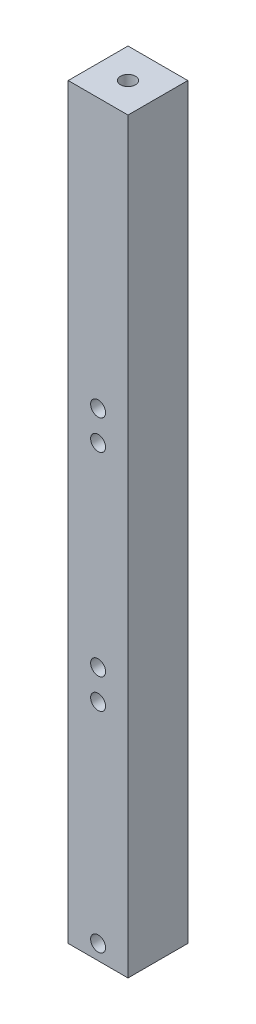
ISO-10303-21;
HEADER;
FILE_DESCRIPTION(('STEP AP214'),'2;1');
FILE_NAME('part.step','',(''),(''),'','','');
FILE_SCHEMA(('AUTOMOTIVE_DESIGN { 1 0 10303 214 1 1 1 1 }'));
ENDSEC;
DATA;
#1=APPLICATION_CONTEXT('core data for automotive mechanical design processes');
#2=APPLICATION_PROTOCOL_DEFINITION('international standard','automotive_design',2000,#1);
#3=PRODUCT_CONTEXT('',#1,'mechanical');
#4=PRODUCT('Part','Part','',(#3));
#5=PRODUCT_RELATED_PRODUCT_CATEGORY('part','',(#4));
#6=PRODUCT_DEFINITION_FORMATION('','',#4);
#7=PRODUCT_DEFINITION_CONTEXT('part definition',#1,'design');
#8=PRODUCT_DEFINITION('design','',#6,#7);
#9=PRODUCT_DEFINITION_SHAPE('','',#8);
#10=(LENGTH_UNIT() NAMED_UNIT(*) SI_UNIT(.MILLI.,.METRE.));
#11=(NAMED_UNIT(*) PLANE_ANGLE_UNIT() SI_UNIT($,.RADIAN.));
#12=(NAMED_UNIT(*) SI_UNIT($,.STERADIAN.) SOLID_ANGLE_UNIT());
#13=UNCERTAINTY_MEASURE_WITH_UNIT(LENGTH_MEASURE(1.E-05),#10,'distance_accuracy_value','');
#14=(GEOMETRIC_REPRESENTATION_CONTEXT(3) GLOBAL_UNCERTAINTY_ASSIGNED_CONTEXT((#13)) GLOBAL_UNIT_ASSIGNED_CONTEXT((#10,
#11,#12)) REPRESENTATION_CONTEXT('',''));
#15=CARTESIAN_POINT('',(0.,0.,0.));
#16=DIRECTION('',(0.,0.,1.));
#17=DIRECTION('',(1.,0.,0.));
#18=AXIS2_PLACEMENT_3D('',#15,#16,#17);
#19=CARTESIAN_POINT('',(0.,250.,0.));
#20=DIRECTION('',(0.,-1.,0.));
#21=DIRECTION('',(0.,0.,-1.));
#22=AXIS2_PLACEMENT_3D('',#19,#20,#21);
#23=CYLINDRICAL_SURFACE('',#22,2.5);
#24=CARTESIAN_POINT('',(0.,160.,0.));
#25=DIRECTION('',(0.,-0.707106781186547,0.707106781186547));
#26=DIRECTION('',(0.,-0.707106781186547,-0.707106781186547));
#27=AXIS2_PLACEMENT_3D('',#24,#25,#26);
#28=ELLIPSE('',#27,3.53553390593274,2.5);
#29=CARTESIAN_POINT('',(-2.5,160.,0.));
#30=VERTEX_POINT('',#29);
#31=CARTESIAN_POINT('',(2.5,160.,0.));
#32=VERTEX_POINT('',#31);
#33=EDGE_CURVE('E109',#30,#32,#28,.F.);
#34=ORIENTED_EDGE('',*,*,#33,.F.);
#35=CARTESIAN_POINT('',(0.,160.,0.));
#36=DIRECTION('',(0.,-0.707106781186547,-0.707106781186547));
#37=DIRECTION('',(0.,-0.707106781186547,0.707106781186547));
#38=AXIS2_PLACEMENT_3D('',#35,#36,#37);
#39=ELLIPSE('',#38,3.53553390593274,2.5);
#40=EDGE_CURVE('E47',#32,#30,#39,.F.);
#41=ORIENTED_EDGE('',*,*,#40,.F.);
#42=EDGE_LOOP('',(#34,#41));
#43=FACE_BOUND('',#42,.T.);
#44=CARTESIAN_POINT('',(0.,250.,0.));
#45=DIRECTION('',(0.,1.,0.));
#46=DIRECTION('',(0.,0.,1.));
#47=AXIS2_PLACEMENT_3D('',#44,#45,#46);
#48=CIRCLE('',#47,2.5);
#49=CARTESIAN_POINT('',(0.,250.,2.5));
#50=VERTEX_POINT('',#49);
#51=EDGE_CURVE('E179',#50,#50,#48,.T.);
#52=ORIENTED_EDGE('',*,*,#51,.T.);
#53=EDGE_LOOP('',(#52));
#54=FACE_BOUND('',#53,.T.);
#55=ADVANCED_FACE('F33',(#43,#54),#23,.F.);
#56=CARTESIAN_POINT('',(0.,160.,0.));
#57=DIRECTION('',(0.,-0.707106781186547,0.707106781186547));
#58=DIRECTION('',(0.,-0.707106781186547,-0.707106781186547));
#59=AXIS2_PLACEMENT_3D('',#56,#57,#58);
#60=ELLIPSE('',#59,3.53553390593274,2.5);
#61=EDGE_CURVE('E112',#30,#32,#60,.T.);
#62=ORIENTED_EDGE('',*,*,#61,.F.);
#63=CARTESIAN_POINT('',(0.,160.,0.));
#64=DIRECTION('',(0.,-0.707106781186547,-0.707106781186547));
#65=DIRECTION('',(0.,-0.707106781186547,0.707106781186547));
#66=AXIS2_PLACEMENT_3D('',#63,#64,#65);
#67=ELLIPSE('',#66,3.53553390593274,2.5);
#68=EDGE_CURVE('E106',#32,#30,#67,.T.);
#69=ORIENTED_EDGE('',*,*,#68,.F.);
#70=EDGE_LOOP('',(#62,#69));
#71=FACE_BOUND('',#70,.T.);
#72=CARTESIAN_POINT('',(0.,150.,0.));
#73=DIRECTION('',(0.,-0.707106781186547,0.707106781186547));
#74=DIRECTION('',(0.,-0.707106781186547,-0.707106781186547));
#75=AXIS2_PLACEMENT_3D('',#72,#73,#74);
#76=ELLIPSE('',#75,3.53553390593274,2.5);
#77=CARTESIAN_POINT('',(-2.5,150.,0.));
#78=VERTEX_POINT('',#77);
#79=CARTESIAN_POINT('',(2.5,150.,0.));
#80=VERTEX_POINT('',#79);
#81=EDGE_CURVE('E135',#78,#80,#76,.F.);
#82=ORIENTED_EDGE('',*,*,#81,.F.);
#83=CARTESIAN_POINT('',(0.,150.,0.));
#84=DIRECTION('',(0.,-0.707106781186547,-0.707106781186547));
#85=DIRECTION('',(0.,-0.707106781186547,0.707106781186547));
#86=AXIS2_PLACEMENT_3D('',#83,#84,#85);
#87=ELLIPSE('',#86,3.53553390593274,2.5);
#88=EDGE_CURVE('E54',#80,#78,#87,.F.);
#89=ORIENTED_EDGE('',*,*,#88,.F.);
#90=EDGE_LOOP('',(#82,#89));
#91=FACE_BOUND('',#90,.T.);
#92=ADVANCED_FACE('F122',(#71,#91),#23,.F.);
#93=CARTESIAN_POINT('',(0.,150.,0.));
#94=DIRECTION('',(0.,-0.707106781186547,0.707106781186547));
#95=DIRECTION('',(0.,-0.707106781186547,-0.707106781186547));
#96=AXIS2_PLACEMENT_3D('',#93,#94,#95);
#97=ELLIPSE('',#96,3.53553390593274,2.5);
#98=EDGE_CURVE('E133',#78,#80,#97,.T.);
#99=ORIENTED_EDGE('',*,*,#98,.F.);
#100=CARTESIAN_POINT('',(0.,150.,0.));
#101=DIRECTION('',(0.,-0.707106781186547,-0.707106781186547));
#102=DIRECTION('',(0.,-0.707106781186547,0.707106781186547));
#103=AXIS2_PLACEMENT_3D('',#100,#101,#102);
#104=ELLIPSE('',#103,3.53553390593274,2.5);
#105=EDGE_CURVE('E131',#80,#78,#104,.T.);
#106=ORIENTED_EDGE('',*,*,#105,.F.);
#107=EDGE_LOOP('',(#99,#106));
#108=FACE_BOUND('',#107,.T.);
#109=CARTESIAN_POINT('',(0.,85.,0.));
#110=DIRECTION('',(0.,-0.707106781186547,0.707106781186547));
#111=DIRECTION('',(0.,-0.707106781186547,-0.707106781186547));
#112=AXIS2_PLACEMENT_3D('',#109,#110,#111);
#113=ELLIPSE('',#112,3.53553390593274,2.5);
#114=CARTESIAN_POINT('',(-2.5,85.,0.));
#115=VERTEX_POINT('',#114);
#116=CARTESIAN_POINT('',(2.5,85.,0.));
#117=VERTEX_POINT('',#116);
#118=EDGE_CURVE('E152',#115,#117,#113,.F.);
#119=ORIENTED_EDGE('',*,*,#118,.F.);
#120=CARTESIAN_POINT('',(0.,85.,0.));
#121=DIRECTION('',(0.,-0.707106781186547,-0.707106781186547));
#122=DIRECTION('',(0.,-0.707106781186547,0.707106781186547));
#123=AXIS2_PLACEMENT_3D('',#120,#121,#122);
#124=ELLIPSE('',#123,3.53553390593274,2.5);
#125=EDGE_CURVE('E142',#117,#115,#124,.F.);
#126=ORIENTED_EDGE('',*,*,#125,.F.);
#127=EDGE_LOOP('',(#119,#126));
#128=FACE_BOUND('',#127,.T.);
#129=ADVANCED_FACE('F257',(#108,#128),#23,.F.);
#130=CARTESIAN_POINT('',(0.,85.,0.));
#131=DIRECTION('',(0.,-0.707106781186547,0.707106781186547));
#132=DIRECTION('',(0.,-0.707106781186547,-0.707106781186547));
#133=AXIS2_PLACEMENT_3D('',#130,#131,#132);
#134=ELLIPSE('',#133,3.53553390593274,2.5);
#135=EDGE_CURVE('E149',#115,#117,#134,.T.);
#136=ORIENTED_EDGE('',*,*,#135,.F.);
#137=CARTESIAN_POINT('',(0.,85.,0.));
#138=DIRECTION('',(0.,-0.707106781186547,-0.707106781186547));
#139=DIRECTION('',(0.,-0.707106781186547,0.707106781186547));
#140=AXIS2_PLACEMENT_3D('',#137,#138,#139);
#141=ELLIPSE('',#140,3.53553390593274,2.5);
#142=EDGE_CURVE('E147',#117,#115,#141,.T.);
#143=ORIENTED_EDGE('',*,*,#142,.F.);
#144=EDGE_LOOP('',(#136,#143));
#145=FACE_BOUND('',#144,.T.);
#146=CARTESIAN_POINT('',(0.,75.,0.));
#147=DIRECTION('',(0.,-0.707106781186547,0.707106781186547));
#148=DIRECTION('',(0.,-0.707106781186547,-0.707106781186547));
#149=AXIS2_PLACEMENT_3D('',#146,#147,#148);
#150=ELLIPSE('',#149,3.53553390593274,2.5);
#151=CARTESIAN_POINT('',(-2.5,75.,0.));
#152=VERTEX_POINT('',#151);
#153=CARTESIAN_POINT('',(2.5,75.,0.));
#154=VERTEX_POINT('',#153);
#155=EDGE_CURVE('E169',#152,#154,#150,.F.);
#156=ORIENTED_EDGE('',*,*,#155,.F.);
#157=CARTESIAN_POINT('',(0.,75.,0.));
#158=DIRECTION('',(0.,-0.707106781186547,-0.707106781186547));
#159=DIRECTION('',(0.,-0.707106781186547,0.707106781186547));
#160=AXIS2_PLACEMENT_3D('',#157,#158,#159);
#161=ELLIPSE('',#160,3.53553390593274,2.5);
#162=EDGE_CURVE('E159',#154,#152,#161,.F.);
#163=ORIENTED_EDGE('',*,*,#162,.F.);
#164=EDGE_LOOP('',(#156,#163));
#165=FACE_BOUND('',#164,.T.);
#166=ADVANCED_FACE('F364',(#145,#165),#23,.F.);
#167=CARTESIAN_POINT('',(0.,75.,0.));
#168=DIRECTION('',(0.,-0.707106781186547,0.707106781186547));
#169=DIRECTION('',(0.,-0.707106781186547,-0.707106781186547));
#170=AXIS2_PLACEMENT_3D('',#167,#168,#169);
#171=ELLIPSE('',#170,3.53553390593274,2.5);
#172=EDGE_CURVE('E166',#152,#154,#171,.T.);
#173=ORIENTED_EDGE('',*,*,#172,.F.);
#174=CARTESIAN_POINT('',(0.,75.,0.));
#175=DIRECTION('',(0.,-0.707106781186547,-0.707106781186547));
#176=DIRECTION('',(0.,-0.707106781186547,0.707106781186547));
#177=AXIS2_PLACEMENT_3D('',#174,#175,#176);
#178=ELLIPSE('',#177,3.53553390593274,2.5);
#179=EDGE_CURVE('E164',#154,#152,#178,.T.);
#180=ORIENTED_EDGE('',*,*,#179,.F.);
#181=EDGE_LOOP('',(#173,#180));
#182=FACE_BOUND('',#181,.T.);
#183=CARTESIAN_POINT('',(0.,5.,0.));
#184=DIRECTION('',(0.,-0.707106781186547,0.707106781186547));
#185=DIRECTION('',(0.,-0.707106781186547,-0.707106781186547));
#186=AXIS2_PLACEMENT_3D('',#183,#184,#185);
#187=ELLIPSE('',#186,3.53553390593274,2.5);
#188=CARTESIAN_POINT('',(-2.5,5.,0.));
#189=VERTEX_POINT('',#188);
#190=CARTESIAN_POINT('',(2.5,5.,0.));
#191=VERTEX_POINT('',#190);
#192=EDGE_CURVE('E11',#189,#191,#187,.F.);
#193=ORIENTED_EDGE('',*,*,#192,.F.);
#194=CARTESIAN_POINT('',(0.,5.,0.));
#195=DIRECTION('',(0.,-0.707106781186547,-0.707106781186547));
#196=DIRECTION('',(0.,-0.707106781186547,0.707106781186547));
#197=AXIS2_PLACEMENT_3D('',#194,#195,#196);
#198=ELLIPSE('',#197,3.53553390593274,2.5);
#199=EDGE_CURVE('E214',#191,#189,#198,.F.);
#200=ORIENTED_EDGE('',*,*,#199,.F.);
#201=EDGE_LOOP('',(#193,#200));
#202=FACE_BOUND('',#201,.T.);
#203=ADVANCED_FACE('F235',(#182,#202),#23,.F.);
#204=CARTESIAN_POINT('',(0.,250.,0.));
#205=DIRECTION('',(0.,-1.,0.));
#206=DIRECTION('',(0.,0.,-1.));
#207=AXIS2_PLACEMENT_3D('',#204,#205,#206);
#208=PLANE('',#207);
#209=DIRECTION('',(0.,0.,-1.));
#210=VECTOR('',#209,1.);
#211=CARTESIAN_POINT('',(10.,250.,10.));
#212=LINE('',#211,#210);
#213=CARTESIAN_POINT('',(10.,250.,10.));
#214=VERTEX_POINT('',#213);
#215=CARTESIAN_POINT('',(10.,250.,-10.));
#216=VERTEX_POINT('',#215);
#217=EDGE_CURVE('E185',#214,#216,#212,.T.);
#218=ORIENTED_EDGE('',*,*,#217,.T.);
#219=DIRECTION('',(-1.,0.,0.));
#220=VECTOR('',#219,1.);
#221=CARTESIAN_POINT('',(-10.,250.,-10.));
#222=LINE('',#221,#220);
#223=CARTESIAN_POINT('',(-10.,250.,-10.));
#224=VERTEX_POINT('',#223);
#225=EDGE_CURVE('E188',#216,#224,#222,.T.);
#226=ORIENTED_EDGE('',*,*,#225,.T.);
#227=DIRECTION('',(0.,0.,1.));
#228=VECTOR('',#227,1.);
#229=CARTESIAN_POINT('',(-10.,250.,10.));
#230=LINE('',#229,#228);
#231=CARTESIAN_POINT('',(-10.,250.,10.));
#232=VERTEX_POINT('',#231);
#233=EDGE_CURVE('E191',#224,#232,#230,.T.);
#234=ORIENTED_EDGE('',*,*,#233,.T.);
#235=DIRECTION('',(1.,0.,0.));
#236=VECTOR('',#235,1.);
#237=CARTESIAN_POINT('',(-10.,250.,10.));
#238=LINE('',#237,#236);
#239=EDGE_CURVE('E193',#232,#214,#238,.T.);
#240=ORIENTED_EDGE('',*,*,#239,.T.);
#241=EDGE_LOOP('',(#218,#226,#234,#240));
#242=FACE_BOUND('',#241,.T.);
#243=ORIENTED_EDGE('',*,*,#51,.F.);
#244=EDGE_LOOP('',(#243));
#245=FACE_BOUND('',#244,.T.);
#246=ADVANCED_FACE('F240',(#242,#245),#208,.F.);
#247=CARTESIAN_POINT('',(0.,0.,0.));
#248=DIRECTION('',(0.,-1.,0.));
#249=DIRECTION('',(0.,0.,-1.));
#250=AXIS2_PLACEMENT_3D('',#247,#248,#249);
#251=PLANE('',#250);
#252=DIRECTION('',(0.,0.,-1.));
#253=VECTOR('',#252,1.);
#254=CARTESIAN_POINT('',(10.,0.,10.));
#255=LINE('',#254,#253);
#256=CARTESIAN_POINT('',(10.,0.,10.));
#257=VERTEX_POINT('',#256);
#258=CARTESIAN_POINT('',(10.,0.,-10.));
#259=VERTEX_POINT('',#258);
#260=EDGE_CURVE('E182',#257,#259,#255,.T.);
#261=ORIENTED_EDGE('',*,*,#260,.F.);
#262=DIRECTION('',(1.,0.,0.));
#263=VECTOR('',#262,1.);
#264=CARTESIAN_POINT('',(-10.,0.,10.));
#265=LINE('',#264,#263);
#266=CARTESIAN_POINT('',(-10.,0.,10.));
#267=VERTEX_POINT('',#266);
#268=EDGE_CURVE('E189',#267,#257,#265,.T.);
#269=ORIENTED_EDGE('',*,*,#268,.F.);
#270=DIRECTION('',(0.,0.,1.));
#271=VECTOR('',#270,1.);
#272=CARTESIAN_POINT('',(-10.,0.,10.));
#273=LINE('',#272,#271);
#274=CARTESIAN_POINT('',(-10.,0.,-10.));
#275=VERTEX_POINT('',#274);
#276=EDGE_CURVE('E200',#275,#267,#273,.T.);
#277=ORIENTED_EDGE('',*,*,#276,.F.);
#278=DIRECTION('',(-1.,0.,0.));
#279=VECTOR('',#278,1.);
#280=CARTESIAN_POINT('',(-10.,0.,-10.));
#281=LINE('',#280,#279);
#282=EDGE_CURVE('E198',#259,#275,#281,.T.);
#283=ORIENTED_EDGE('',*,*,#282,.F.);
#284=EDGE_LOOP('',(#261,#269,#277,#283));
#285=FACE_BOUND('',#284,.T.);
#286=CARTESIAN_POINT('',(0.,0.,0.));
#287=DIRECTION('',(0.,1.,0.));
#288=DIRECTION('',(0.,0.,1.));
#289=AXIS2_PLACEMENT_3D('',#286,#287,#288);
#290=CIRCLE('',#289,2.5);
#291=CARTESIAN_POINT('',(0.,0.,2.5));
#292=VERTEX_POINT('',#291);
#293=EDGE_CURVE('E176',#292,#292,#290,.T.);
#294=ORIENTED_EDGE('',*,*,#293,.T.);
#295=EDGE_LOOP('',(#294));
#296=FACE_BOUND('',#295,.T.);
#297=ADVANCED_FACE('F238',(#285,#296),#251,.T.);
#298=CARTESIAN_POINT('',(10.,250.,10.));
#299=DIRECTION('',(-1.,0.,0.));
#300=DIRECTION('',(0.,0.,1.));
#301=AXIS2_PLACEMENT_3D('',#298,#299,#300);
#302=PLANE('',#301);
#303=ORIENTED_EDGE('',*,*,#260,.T.);
#304=DIRECTION('',(0.,-1.,0.));
#305=VECTOR('',#304,1.);
#306=CARTESIAN_POINT('',(10.,250.,-10.));
#307=LINE('',#306,#305);
#308=EDGE_CURVE('E211',#216,#259,#307,.T.);
#309=ORIENTED_EDGE('',*,*,#308,.F.);
#310=ORIENTED_EDGE('',*,*,#217,.F.);
#311=DIRECTION('',(0.,-1.,0.));
#312=VECTOR('',#311,1.);
#313=CARTESIAN_POINT('',(10.,250.,10.));
#314=LINE('',#313,#312);
#315=EDGE_CURVE('E195',#214,#257,#314,.T.);
#316=ORIENTED_EDGE('',*,*,#315,.T.);
#317=EDGE_LOOP('',(#303,#309,#310,#316));
#318=FACE_BOUND('',#317,.T.);
#319=ADVANCED_FACE('F35',(#318),#302,.F.);
#320=CARTESIAN_POINT('',(-10.,250.,-10.));
#321=DIRECTION('',(0.,0.,1.));
#322=DIRECTION('',(1.,0.,0.));
#323=AXIS2_PLACEMENT_3D('',#320,#321,#322);
#324=PLANE('',#323);
#325=CARTESIAN_POINT('',(0.,160.,-10.));
#326=DIRECTION('',(0.,0.,1.));
#327=DIRECTION('',(1.,0.,0.));
#328=AXIS2_PLACEMENT_3D('',#325,#326,#327);
#329=CIRCLE('',#328,2.5);
#330=CARTESIAN_POINT('',(2.5,160.,-10.));
#331=VERTEX_POINT('',#330);
#332=EDGE_CURVE('E117',#331,#331,#329,.T.);
#333=ORIENTED_EDGE('',*,*,#332,.T.);
#334=EDGE_LOOP('',(#333));
#335=FACE_BOUND('',#334,.T.);
#336=CARTESIAN_POINT('',(0.,150.,-10.));
#337=DIRECTION('',(0.,0.,1.));
#338=DIRECTION('',(1.,0.,0.));
#339=AXIS2_PLACEMENT_3D('',#336,#337,#338);
#340=CIRCLE('',#339,2.5);
#341=CARTESIAN_POINT('',(2.5,150.,-10.));
#342=VERTEX_POINT('',#341);
#343=EDGE_CURVE('E125',#342,#342,#340,.T.);
#344=ORIENTED_EDGE('',*,*,#343,.T.);
#345=EDGE_LOOP('',(#344));
#346=FACE_BOUND('',#345,.T.);
#347=CARTESIAN_POINT('',(0.,85.,-10.));
#348=DIRECTION('',(0.,0.,1.));
#349=DIRECTION('',(1.,0.,0.));
#350=AXIS2_PLACEMENT_3D('',#347,#348,#349);
#351=CIRCLE('',#350,2.5);
#352=CARTESIAN_POINT('',(2.5,85.,-10.));
#353=VERTEX_POINT('',#352);
#354=EDGE_CURVE('E139',#353,#353,#351,.T.);
#355=ORIENTED_EDGE('',*,*,#354,.T.);
#356=EDGE_LOOP('',(#355));
#357=FACE_BOUND('',#356,.T.);
#358=CARTESIAN_POINT('',(0.,75.,-10.));
#359=DIRECTION('',(0.,0.,1.));
#360=DIRECTION('',(1.,0.,0.));
#361=AXIS2_PLACEMENT_3D('',#358,#359,#360);
#362=CIRCLE('',#361,2.5);
#363=CARTESIAN_POINT('',(2.5,75.,-10.));
#364=VERTEX_POINT('',#363);
#365=EDGE_CURVE('E156',#364,#364,#362,.T.);
#366=ORIENTED_EDGE('',*,*,#365,.T.);
#367=EDGE_LOOP('',(#366));
#368=FACE_BOUND('',#367,.T.);
#369=CARTESIAN_POINT('',(0.,5.,-10.));
#370=DIRECTION('',(0.,0.,1.));
#371=DIRECTION('',(1.,0.,0.));
#372=AXIS2_PLACEMENT_3D('',#369,#370,#371);
#373=CIRCLE('',#372,2.5);
#374=CARTESIAN_POINT('',(2.5,5.,-10.));
#375=VERTEX_POINT('',#374);
#376=EDGE_CURVE('E173',#375,#375,#373,.T.);
#377=ORIENTED_EDGE('',*,*,#376,.T.);
#378=EDGE_LOOP('',(#377));
#379=FACE_BOUND('',#378,.T.);
#380=ORIENTED_EDGE('',*,*,#282,.T.);
#381=DIRECTION('',(0.,-1.,0.));
#382=VECTOR('',#381,1.);
#383=CARTESIAN_POINT('',(-10.,250.,-10.));
#384=LINE('',#383,#382);
#385=EDGE_CURVE('E208',#224,#275,#384,.T.);
#386=ORIENTED_EDGE('',*,*,#385,.F.);
#387=ORIENTED_EDGE('',*,*,#225,.F.);
#388=ORIENTED_EDGE('',*,*,#308,.T.);
#389=EDGE_LOOP('',(#380,#386,#387,#388));
#390=FACE_BOUND('',#389,.T.);
#391=ADVANCED_FACE('F247',(#335,#346,#357,#368,#379,#390),#324,.F.);
#392=CARTESIAN_POINT('',(-10.,250.,10.));
#393=DIRECTION('',(1.,0.,0.));
#394=DIRECTION('',(0.,0.,-1.));
#395=AXIS2_PLACEMENT_3D('',#392,#393,#394);
#396=PLANE('',#395);
#397=ORIENTED_EDGE('',*,*,#276,.T.);
#398=DIRECTION('',(0.,-1.,0.));
#399=VECTOR('',#398,1.);
#400=CARTESIAN_POINT('',(-10.,250.,10.));
#401=LINE('',#400,#399);
#402=EDGE_CURVE('E205',#232,#267,#401,.T.);
#403=ORIENTED_EDGE('',*,*,#402,.F.);
#404=ORIENTED_EDGE('',*,*,#233,.F.);
#405=ORIENTED_EDGE('',*,*,#385,.T.);
#406=EDGE_LOOP('',(#397,#403,#404,#405));
#407=FACE_BOUND('',#406,.T.);
#408=ADVANCED_FACE('F290',(#407),#396,.F.);
#409=CARTESIAN_POINT('',(-10.,250.,10.));
#410=DIRECTION('',(0.,0.,-1.));
#411=DIRECTION('',(-1.,0.,0.));
#412=AXIS2_PLACEMENT_3D('',#409,#410,#411);
#413=PLANE('',#412);
#414=CARTESIAN_POINT('',(0.,160.,10.));
#415=DIRECTION('',(0.,0.,1.));
#416=DIRECTION('',(1.,0.,0.));
#417=AXIS2_PLACEMENT_3D('',#414,#415,#416);
#418=CIRCLE('',#417,2.5);
#419=CARTESIAN_POINT('',(2.5,160.,10.));
#420=VERTEX_POINT('',#419);
#421=EDGE_CURVE('E320',#420,#420,#418,.T.);
#422=ORIENTED_EDGE('',*,*,#421,.F.);
#423=EDGE_LOOP('',(#422));
#424=FACE_BOUND('',#423,.T.);
#425=CARTESIAN_POINT('',(0.,150.,10.));
#426=DIRECTION('',(0.,0.,1.));
#427=DIRECTION('',(1.,0.,0.));
#428=AXIS2_PLACEMENT_3D('',#425,#426,#427);
#429=CIRCLE('',#428,2.5);
#430=CARTESIAN_POINT('',(2.5,150.,10.));
#431=VERTEX_POINT('',#430);
#432=EDGE_CURVE('E120',#431,#431,#429,.T.);
#433=ORIENTED_EDGE('',*,*,#432,.F.);
#434=EDGE_LOOP('',(#433));
#435=FACE_BOUND('',#434,.T.);
#436=CARTESIAN_POINT('',(0.,85.,10.));
#437=DIRECTION('',(0.,0.,1.));
#438=DIRECTION('',(1.,0.,0.));
#439=AXIS2_PLACEMENT_3D('',#436,#437,#438);
#440=CIRCLE('',#439,2.5);
#441=CARTESIAN_POINT('',(2.5,85.,10.));
#442=VERTEX_POINT('',#441);
#443=EDGE_CURVE('E138',#442,#442,#440,.T.);
#444=ORIENTED_EDGE('',*,*,#443,.F.);
#445=EDGE_LOOP('',(#444));
#446=FACE_BOUND('',#445,.T.);
#447=CARTESIAN_POINT('',(0.,75.,10.));
#448=DIRECTION('',(0.,0.,1.));
#449=DIRECTION('',(1.,0.,0.));
#450=AXIS2_PLACEMENT_3D('',#447,#448,#449);
#451=CIRCLE('',#450,2.5);
#452=CARTESIAN_POINT('',(2.5,75.,10.));
#453=VERTEX_POINT('',#452);
#454=EDGE_CURVE('E155',#453,#453,#451,.T.);
#455=ORIENTED_EDGE('',*,*,#454,.F.);
#456=EDGE_LOOP('',(#455));
#457=FACE_BOUND('',#456,.T.);
#458=CARTESIAN_POINT('',(0.,5.,10.));
#459=DIRECTION('',(0.,0.,1.));
#460=DIRECTION('',(1.,0.,0.));
#461=AXIS2_PLACEMENT_3D('',#458,#459,#460);
#462=CIRCLE('',#461,2.5);
#463=CARTESIAN_POINT('',(2.5,5.,10.));
#464=VERTEX_POINT('',#463);
#465=EDGE_CURVE('E172',#464,#464,#462,.T.);
#466=ORIENTED_EDGE('',*,*,#465,.F.);
#467=EDGE_LOOP('',(#466));
#468=FACE_BOUND('',#467,.T.);
#469=ORIENTED_EDGE('',*,*,#268,.T.);
#470=ORIENTED_EDGE('',*,*,#315,.F.);
#471=ORIENTED_EDGE('',*,*,#239,.F.);
#472=ORIENTED_EDGE('',*,*,#402,.T.);
#473=EDGE_LOOP('',(#469,#470,#471,#472));
#474=FACE_BOUND('',#473,.T.);
#475=ADVANCED_FACE('F233',(#424,#435,#446,#457,#468,#474),#413,.F.);
#476=CARTESIAN_POINT('',(0.,5.,0.));
#477=DIRECTION('',(0.,-0.707106781186547,0.707106781186547));
#478=DIRECTION('',(0.,-0.707106781186547,-0.707106781186547));
#479=AXIS2_PLACEMENT_3D('',#476,#477,#478);
#480=ELLIPSE('',#479,3.53553390593274,2.5);
#481=EDGE_CURVE('E41',#189,#191,#480,.T.);
#482=ORIENTED_EDGE('',*,*,#481,.F.);
#483=CARTESIAN_POINT('',(0.,5.,0.));
#484=DIRECTION('',(0.,-0.707106781186547,-0.707106781186547));
#485=DIRECTION('',(0.,-0.707106781186547,0.707106781186547));
#486=AXIS2_PLACEMENT_3D('',#483,#484,#485);
#487=ELLIPSE('',#486,3.53553390593274,2.5);
#488=EDGE_CURVE('E217',#191,#189,#487,.T.);
#489=ORIENTED_EDGE('',*,*,#488,.F.);
#490=EDGE_LOOP('',(#482,#489));
#491=FACE_BOUND('',#490,.T.);
#492=ORIENTED_EDGE('',*,*,#293,.F.);
#493=EDGE_LOOP('',(#492));
#494=FACE_BOUND('',#493,.T.);
#495=ADVANCED_FACE('F230',(#491,#494),#23,.F.);
#496=CARTESIAN_POINT('',(0.,5.,-10.));
#497=DIRECTION('',(0.,0.,1.));
#498=DIRECTION('',(1.,0.,0.));
#499=AXIS2_PLACEMENT_3D('',#496,#497,#498);
#500=CYLINDRICAL_SURFACE('',#499,2.5);
#501=ORIENTED_EDGE('',*,*,#481,.T.);
#502=ORIENTED_EDGE('',*,*,#199,.T.);
#503=EDGE_LOOP('',(#501,#502));
#504=FACE_BOUND('',#503,.T.);
#505=ORIENTED_EDGE('',*,*,#376,.F.);
#506=EDGE_LOOP('',(#505));
#507=FACE_BOUND('',#506,.T.);
#508=ADVANCED_FACE('F221',(#504,#507),#500,.F.);
#509=ORIENTED_EDGE('',*,*,#192,.T.);
#510=ORIENTED_EDGE('',*,*,#488,.T.);
#511=EDGE_LOOP('',(#509,#510));
#512=FACE_BOUND('',#511,.T.);
#513=ORIENTED_EDGE('',*,*,#465,.T.);
#514=EDGE_LOOP('',(#513));
#515=FACE_BOUND('',#514,.T.);
#516=ADVANCED_FACE('F227',(#512,#515),#500,.F.);
#517=CARTESIAN_POINT('',(0.,75.,-10.));
#518=DIRECTION('',(0.,0.,1.));
#519=DIRECTION('',(1.,0.,0.));
#520=AXIS2_PLACEMENT_3D('',#517,#518,#519);
#521=CYLINDRICAL_SURFACE('',#520,2.5);
#522=ORIENTED_EDGE('',*,*,#155,.T.);
#523=ORIENTED_EDGE('',*,*,#179,.T.);
#524=EDGE_LOOP('',(#522,#523));
#525=FACE_BOUND('',#524,.T.);
#526=ORIENTED_EDGE('',*,*,#454,.T.);
#527=EDGE_LOOP('',(#526));
#528=FACE_BOUND('',#527,.T.);
#529=ADVANCED_FACE('F261',(#525,#528),#521,.F.);
#530=ORIENTED_EDGE('',*,*,#172,.T.);
#531=ORIENTED_EDGE('',*,*,#162,.T.);
#532=EDGE_LOOP('',(#530,#531));
#533=FACE_BOUND('',#532,.T.);
#534=ORIENTED_EDGE('',*,*,#365,.F.);
#535=EDGE_LOOP('',(#534));
#536=FACE_BOUND('',#535,.T.);
#537=ADVANCED_FACE('F264',(#533,#536),#521,.F.);
#538=CARTESIAN_POINT('',(0.,85.,-10.));
#539=DIRECTION('',(0.,0.,1.));
#540=DIRECTION('',(1.,0.,0.));
#541=AXIS2_PLACEMENT_3D('',#538,#539,#540);
#542=CYLINDRICAL_SURFACE('',#541,2.5);
#543=ORIENTED_EDGE('',*,*,#118,.T.);
#544=ORIENTED_EDGE('',*,*,#142,.T.);
#545=EDGE_LOOP('',(#543,#544));
#546=FACE_BOUND('',#545,.T.);
#547=ORIENTED_EDGE('',*,*,#443,.T.);
#548=EDGE_LOOP('',(#547));
#549=FACE_BOUND('',#548,.T.);
#550=ADVANCED_FACE('F266',(#546,#549),#542,.F.);
#551=ORIENTED_EDGE('',*,*,#135,.T.);
#552=ORIENTED_EDGE('',*,*,#125,.T.);
#553=EDGE_LOOP('',(#551,#552));
#554=FACE_BOUND('',#553,.T.);
#555=ORIENTED_EDGE('',*,*,#354,.F.);
#556=EDGE_LOOP('',(#555));
#557=FACE_BOUND('',#556,.T.);
#558=ADVANCED_FACE('F269',(#554,#557),#542,.F.);
#559=CARTESIAN_POINT('',(0.,150.,-10.));
#560=DIRECTION('',(0.,0.,1.));
#561=DIRECTION('',(1.,0.,0.));
#562=AXIS2_PLACEMENT_3D('',#559,#560,#561);
#563=CYLINDRICAL_SURFACE('',#562,2.5);
#564=ORIENTED_EDGE('',*,*,#81,.T.);
#565=ORIENTED_EDGE('',*,*,#105,.T.);
#566=EDGE_LOOP('',(#564,#565));
#567=FACE_BOUND('',#566,.T.);
#568=ORIENTED_EDGE('',*,*,#432,.T.);
#569=EDGE_LOOP('',(#568));
#570=FACE_BOUND('',#569,.T.);
#571=ADVANCED_FACE('F271',(#567,#570),#563,.F.);
#572=ORIENTED_EDGE('',*,*,#98,.T.);
#573=ORIENTED_EDGE('',*,*,#88,.T.);
#574=EDGE_LOOP('',(#572,#573));
#575=FACE_BOUND('',#574,.T.);
#576=ORIENTED_EDGE('',*,*,#343,.F.);
#577=EDGE_LOOP('',(#576));
#578=FACE_BOUND('',#577,.T.);
#579=ADVANCED_FACE('F274',(#575,#578),#563,.F.);
#580=CARTESIAN_POINT('',(0.,160.,-10.));
#581=DIRECTION('',(0.,0.,1.));
#582=DIRECTION('',(1.,0.,0.));
#583=AXIS2_PLACEMENT_3D('',#580,#581,#582);
#584=CYLINDRICAL_SURFACE('',#583,2.5);
#585=ORIENTED_EDGE('',*,*,#33,.T.);
#586=ORIENTED_EDGE('',*,*,#68,.T.);
#587=EDGE_LOOP('',(#585,#586));
#588=FACE_BOUND('',#587,.T.);
#589=ORIENTED_EDGE('',*,*,#421,.T.);
#590=EDGE_LOOP('',(#589));
#591=FACE_BOUND('',#590,.T.);
#592=ADVANCED_FACE('F107',(#588,#591),#584,.F.);
#593=ORIENTED_EDGE('',*,*,#61,.T.);
#594=ORIENTED_EDGE('',*,*,#40,.T.);
#595=EDGE_LOOP('',(#593,#594));
#596=FACE_BOUND('',#595,.T.);
#597=ORIENTED_EDGE('',*,*,#332,.F.);
#598=EDGE_LOOP('',(#597));
#599=FACE_BOUND('',#598,.T.);
#600=ADVANCED_FACE('F115',(#596,#599),#584,.F.);
#601=CLOSED_SHELL('',(#55,#92,#129,#166,#203,#246,#297,#319,#391,#408,#475,#495,#508,#516,#529,
#537,#550,#558,#571,#579,#592,#600));
#602=MANIFOLD_SOLID_BREP('B2',#601);
#603=ADVANCED_BREP_SHAPE_REPRESENTATION('',(#18,#602),#14);
#604=SHAPE_DEFINITION_REPRESENTATION(#9,#603);
ENDSEC;
END-ISO-10303-21;
